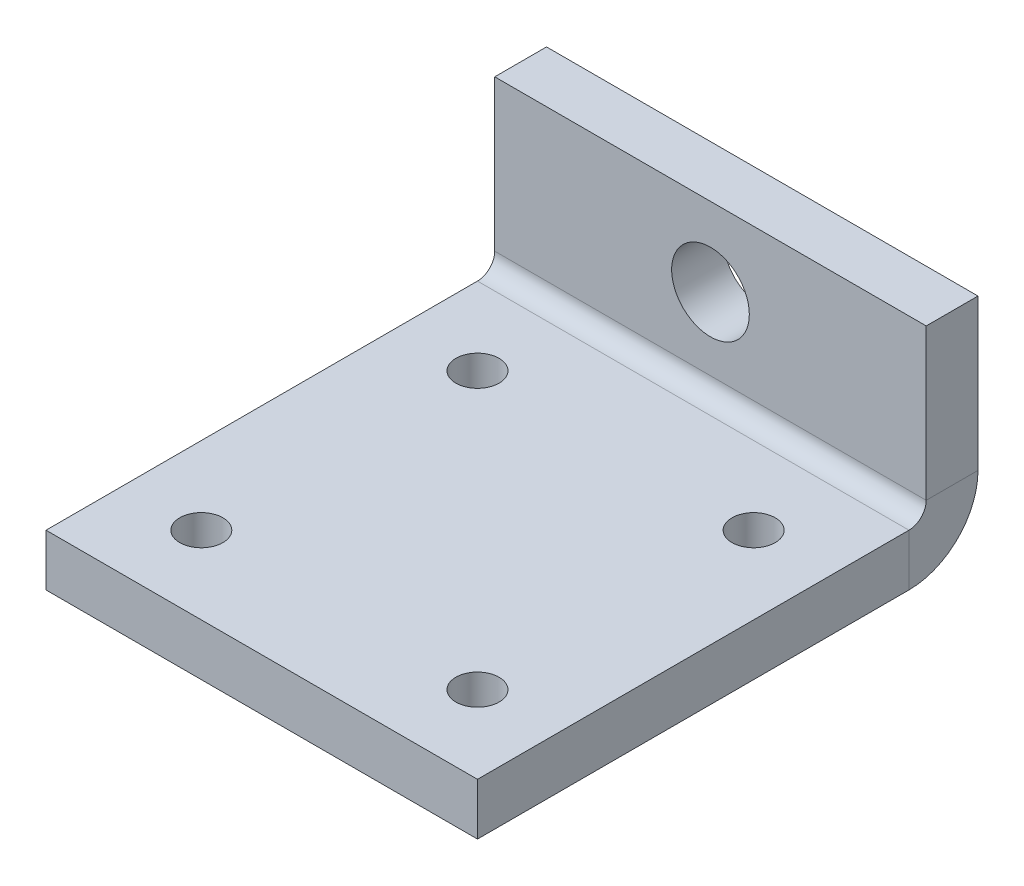
ISO-10303-21;
HEADER;
FILE_DESCRIPTION(('STEP AP214'),'2;1');
FILE_NAME('part.step','',(''),(''),'','','');
FILE_SCHEMA(('AUTOMOTIVE_DESIGN { 1 0 10303 214 1 1 1 1 }'));
ENDSEC;
DATA;
#1=APPLICATION_CONTEXT('core data for automotive mechanical design processes');
#2=APPLICATION_PROTOCOL_DEFINITION('international standard','automotive_design',2000,#1);
#3=PRODUCT_CONTEXT('',#1,'mechanical');
#4=PRODUCT('Part','Part','',(#3));
#5=PRODUCT_RELATED_PRODUCT_CATEGORY('part','',(#4));
#6=PRODUCT_DEFINITION_FORMATION('','',#4);
#7=PRODUCT_DEFINITION_CONTEXT('part definition',#1,'design');
#8=PRODUCT_DEFINITION('design','',#6,#7);
#9=PRODUCT_DEFINITION_SHAPE('','',#8);
#10=(LENGTH_UNIT() NAMED_UNIT(*) SI_UNIT(.MILLI.,.METRE.));
#11=(NAMED_UNIT(*) PLANE_ANGLE_UNIT() SI_UNIT($,.RADIAN.));
#12=(NAMED_UNIT(*) SI_UNIT($,.STERADIAN.) SOLID_ANGLE_UNIT());
#13=UNCERTAINTY_MEASURE_WITH_UNIT(LENGTH_MEASURE(1.E-05),#10,'distance_accuracy_value','');
#14=(GEOMETRIC_REPRESENTATION_CONTEXT(3) GLOBAL_UNCERTAINTY_ASSIGNED_CONTEXT((#13)) GLOBAL_UNIT_ASSIGNED_CONTEXT((#10,
#11,#12)) REPRESENTATION_CONTEXT('',''));
#15=CARTESIAN_POINT('',(0.,0.,0.));
#16=DIRECTION('',(0.,0.,1.));
#17=DIRECTION('',(1.,0.,0.));
#18=AXIS2_PLACEMENT_3D('',#15,#16,#17);
#19=CARTESIAN_POINT('',(25.,0.,3.99999999999999));
#20=DIRECTION('',(1.,0.,0.));
#21=DIRECTION('',(0.,0.,-1.));
#22=AXIS2_PLACEMENT_3D('',#19,#20,#21);
#23=PLANE('',#22);
#24=DIRECTION('',(0.,1.,0.));
#25=VECTOR('',#24,1.);
#26=CARTESIAN_POINT('',(25.,0.,3.99999999999999));
#27=LINE('',#26,#25);
#28=CARTESIAN_POINT('',(25.,0.,3.99999999999999));
#29=VERTEX_POINT('',#28);
#30=CARTESIAN_POINT('',(25.,3.,4.));
#31=VERTEX_POINT('',#30);
#32=EDGE_CURVE('E11',#29,#31,#27,.T.);
#33=ORIENTED_EDGE('',*,*,#32,.F.);
#34=CARTESIAN_POINT('',(25.,4.,4.));
#35=DIRECTION('',(-1.,0.,0.));
#36=DIRECTION('',(0.,0.,1.));
#37=AXIS2_PLACEMENT_3D('',#34,#35,#36);
#38=CIRCLE('',#37,4.);
#39=CARTESIAN_POINT('',(25.,4.,0.));
#40=VERTEX_POINT('',#39);
#41=EDGE_CURVE('E128',#29,#40,#38,.F.);
#42=ORIENTED_EDGE('',*,*,#41,.T.);
#43=DIRECTION('',(0.,0.,-1.));
#44=VECTOR('',#43,1.);
#45=CARTESIAN_POINT('',(25.,4.,3.));
#46=LINE('',#45,#44);
#47=CARTESIAN_POINT('',(25.,4.,3.));
#48=VERTEX_POINT('',#47);
#49=EDGE_CURVE('E46',#48,#40,#46,.T.);
#50=ORIENTED_EDGE('',*,*,#49,.F.);
#51=CARTESIAN_POINT('',(25.,4.,4.));
#52=DIRECTION('',(1.,0.,0.));
#53=DIRECTION('',(0.,0.,-1.));
#54=AXIS2_PLACEMENT_3D('',#51,#52,#53);
#55=CIRCLE('',#54,1.);
#56=EDGE_CURVE('E135',#31,#48,#55,.T.);
#57=ORIENTED_EDGE('',*,*,#56,.F.);
#58=EDGE_LOOP('',(#33,#42,#50,#57));
#59=FACE_BOUND('',#58,.T.);
#60=ADVANCED_FACE('F38',(#59),#23,.T.);
#61=CARTESIAN_POINT('',(25.,4.,3.));
#62=DIRECTION('',(1.,0.,0.));
#63=DIRECTION('',(0.,0.,-1.));
#64=AXIS2_PLACEMENT_3D('',#61,#62,#63);
#65=PLANE('',#64);
#66=DIRECTION('',(0.,0.,-1.));
#67=VECTOR('',#66,1.);
#68=CARTESIAN_POINT('',(25.,0.,0.));
#69=LINE('',#68,#67);
#70=CARTESIAN_POINT('',(25.,0.,29.));
#71=VERTEX_POINT('',#70);
#72=EDGE_CURVE('E123',#71,#29,#69,.T.);
#73=ORIENTED_EDGE('',*,*,#72,.T.);
#74=ORIENTED_EDGE('',*,*,#32,.T.);
#75=DIRECTION('',(0.,0.,-1.));
#76=VECTOR('',#75,1.);
#77=CARTESIAN_POINT('',(25.,3.,0.));
#78=LINE('',#77,#76);
#79=CARTESIAN_POINT('',(25.,3.,29.));
#80=VERTEX_POINT('',#79);
#81=EDGE_CURVE('E133',#80,#31,#78,.T.);
#82=ORIENTED_EDGE('',*,*,#81,.F.);
#83=DIRECTION('',(0.,1.,0.));
#84=VECTOR('',#83,1.);
#85=CARTESIAN_POINT('',(25.,0.,29.));
#86=LINE('',#85,#84);
#87=EDGE_CURVE('E114',#71,#80,#86,.T.);
#88=ORIENTED_EDGE('',*,*,#87,.F.);
#89=EDGE_LOOP('',(#73,#74,#82,#88));
#90=FACE_BOUND('',#89,.T.);
#91=ADVANCED_FACE('F131',(#90),#65,.T.);
#92=CARTESIAN_POINT('',(0.,4.,0.));
#93=DIRECTION('',(-1.,0.,0.));
#94=DIRECTION('',(0.,0.,1.));
#95=AXIS2_PLACEMENT_3D('',#92,#93,#94);
#96=PLANE('',#95);
#97=DIRECTION('',(0.,0.,1.));
#98=VECTOR('',#97,1.);
#99=CARTESIAN_POINT('',(0.,4.,0.));
#100=LINE('',#99,#98);
#101=CARTESIAN_POINT('',(0.,4.,0.));
#102=VERTEX_POINT('',#101);
#103=CARTESIAN_POINT('',(0.,4.,3.));
#104=VERTEX_POINT('',#103);
#105=EDGE_CURVE('E89',#102,#104,#100,.T.);
#106=ORIENTED_EDGE('',*,*,#105,.F.);
#107=CARTESIAN_POINT('',(0.,4.,4.));
#108=DIRECTION('',(-1.,0.,0.));
#109=DIRECTION('',(0.,0.,1.));
#110=AXIS2_PLACEMENT_3D('',#107,#108,#109);
#111=CIRCLE('',#110,4.);
#112=CARTESIAN_POINT('',(0.,0.,3.99999999999999));
#113=VERTEX_POINT('',#112);
#114=EDGE_CURVE('E158',#113,#102,#111,.F.);
#115=ORIENTED_EDGE('',*,*,#114,.F.);
#116=DIRECTION('',(0.,-1.,0.));
#117=VECTOR('',#116,1.);
#118=CARTESIAN_POINT('',(0.,3.,4.));
#119=LINE('',#118,#117);
#120=CARTESIAN_POINT('',(0.,3.,4.));
#121=VERTEX_POINT('',#120);
#122=EDGE_CURVE('E82',#121,#113,#119,.T.);
#123=ORIENTED_EDGE('',*,*,#122,.F.);
#124=CARTESIAN_POINT('',(0.,4.,4.));
#125=DIRECTION('',(1.,0.,0.));
#126=DIRECTION('',(0.,0.,-1.));
#127=AXIS2_PLACEMENT_3D('',#124,#125,#126);
#128=CIRCLE('',#127,1.);
#129=EDGE_CURVE('E151',#121,#104,#128,.T.);
#130=ORIENTED_EDGE('',*,*,#129,.T.);
#131=EDGE_LOOP('',(#106,#115,#123,#130));
#132=FACE_BOUND('',#131,.T.);
#133=ADVANCED_FACE('F190',(#132),#96,.T.);
#134=CARTESIAN_POINT('',(0.,3.,4.));
#135=DIRECTION('',(-1.,0.,0.));
#136=DIRECTION('',(0.,0.,1.));
#137=AXIS2_PLACEMENT_3D('',#134,#135,#136);
#138=PLANE('',#137);
#139=DIRECTION('',(0.,1.,0.));
#140=VECTOR('',#139,1.);
#141=CARTESIAN_POINT('',(0.,0.,0.));
#142=LINE('',#141,#140);
#143=CARTESIAN_POINT('',(0.,12.75,0.));
#144=VERTEX_POINT('',#143);
#145=EDGE_CURVE('E141',#102,#144,#142,.T.);
#146=ORIENTED_EDGE('',*,*,#145,.F.);
#147=ORIENTED_EDGE('',*,*,#105,.T.);
#148=DIRECTION('',(0.,1.,0.));
#149=VECTOR('',#148,1.);
#150=CARTESIAN_POINT('',(0.,0.,3.));
#151=LINE('',#150,#149);
#152=CARTESIAN_POINT('',(0.,12.75,3.));
#153=VERTEX_POINT('',#152);
#154=EDGE_CURVE('E148',#104,#153,#151,.T.);
#155=ORIENTED_EDGE('',*,*,#154,.T.);
#156=DIRECTION('',(0.,0.,-1.));
#157=VECTOR('',#156,1.);
#158=CARTESIAN_POINT('',(0.,12.75,3.));
#159=LINE('',#158,#157);
#160=EDGE_CURVE('E144',#153,#144,#159,.T.);
#161=ORIENTED_EDGE('',*,*,#160,.T.);
#162=EDGE_LOOP('',(#146,#147,#155,#161));
#163=FACE_BOUND('',#162,.T.);
#164=ADVANCED_FACE('F177',(#163),#138,.T.);
#165=CARTESIAN_POINT('',(25.,0.,0.));
#166=DIRECTION('',(0.,0.,1.));
#167=DIRECTION('',(1.,0.,0.));
#168=AXIS2_PLACEMENT_3D('',#165,#166,#167);
#169=PLANE('',#168);
#170=CARTESIAN_POINT('',(12.5,8.2,0.));
#171=DIRECTION('',(0.,0.,1.));
#172=DIRECTION('',(1.,0.,0.));
#173=AXIS2_PLACEMENT_3D('',#170,#171,#172);
#174=CIRCLE('',#173,2.25);
#175=CARTESIAN_POINT('',(14.75,8.2,0.));
#176=VERTEX_POINT('',#175);
#177=EDGE_CURVE('E225',#176,#176,#174,.T.);
#178=ORIENTED_EDGE('',*,*,#177,.T.);
#179=EDGE_LOOP('',(#178));
#180=FACE_BOUND('',#179,.T.);
#181=ORIENTED_EDGE('',*,*,#145,.T.);
#182=DIRECTION('',(-1.,0.,0.));
#183=VECTOR('',#182,1.);
#184=CARTESIAN_POINT('',(25.,12.75,0.));
#185=LINE('',#184,#183);
#186=CARTESIAN_POINT('',(25.,12.75,0.));
#187=VERTEX_POINT('',#186);
#188=EDGE_CURVE('E172',#187,#144,#185,.T.);
#189=ORIENTED_EDGE('',*,*,#188,.F.);
#190=DIRECTION('',(0.,1.,0.));
#191=VECTOR('',#190,1.);
#192=CARTESIAN_POINT('',(25.,0.,0.));
#193=LINE('',#192,#191);
#194=EDGE_CURVE('E95',#40,#187,#193,.T.);
#195=ORIENTED_EDGE('',*,*,#194,.F.);
#196=DIRECTION('',(-1.,0.,0.));
#197=VECTOR('',#196,1.);
#198=CARTESIAN_POINT('',(25.,4.,0.));
#199=LINE('',#198,#197);
#200=EDGE_CURVE('E140',#40,#102,#199,.T.);
#201=ORIENTED_EDGE('',*,*,#200,.T.);
#202=EDGE_LOOP('',(#181,#189,#195,#201));
#203=FACE_BOUND('',#202,.T.);
#204=ADVANCED_FACE('F242',(#180,#203),#169,.F.);
#205=CARTESIAN_POINT('',(25.,12.75,3.));
#206=DIRECTION('',(0.,1.,0.));
#207=DIRECTION('',(0.,0.,1.));
#208=AXIS2_PLACEMENT_3D('',#205,#206,#207);
#209=PLANE('',#208);
#210=ORIENTED_EDGE('',*,*,#160,.F.);
#211=DIRECTION('',(-1.,0.,0.));
#212=VECTOR('',#211,1.);
#213=CARTESIAN_POINT('',(25.,12.75,3.));
#214=LINE('',#213,#212);
#215=CARTESIAN_POINT('',(25.,12.75,3.));
#216=VERTEX_POINT('',#215);
#217=EDGE_CURVE('E170',#216,#153,#214,.T.);
#218=ORIENTED_EDGE('',*,*,#217,.F.);
#219=DIRECTION('',(0.,0.,-1.));
#220=VECTOR('',#219,1.);
#221=CARTESIAN_POINT('',(25.,12.75,3.));
#222=LINE('',#221,#220);
#223=EDGE_CURVE('E196',#216,#187,#222,.T.);
#224=ORIENTED_EDGE('',*,*,#223,.T.);
#225=ORIENTED_EDGE('',*,*,#188,.T.);
#226=EDGE_LOOP('',(#210,#218,#224,#225));
#227=FACE_BOUND('',#226,.T.);
#228=ADVANCED_FACE('F235',(#227),#209,.T.);
#229=CARTESIAN_POINT('',(25.,0.,3.));
#230=DIRECTION('',(0.,0.,1.));
#231=DIRECTION('',(1.,0.,0.));
#232=AXIS2_PLACEMENT_3D('',#229,#230,#231);
#233=PLANE('',#232);
#234=CARTESIAN_POINT('',(12.5,8.2,3.));
#235=DIRECTION('',(0.,0.,1.));
#236=DIRECTION('',(1.,0.,0.));
#237=AXIS2_PLACEMENT_3D('',#234,#235,#236);
#238=CIRCLE('',#237,2.25);
#239=CARTESIAN_POINT('',(14.75,8.2,3.));
#240=VERTEX_POINT('',#239);
#241=EDGE_CURVE('E228',#240,#240,#238,.T.);
#242=ORIENTED_EDGE('',*,*,#241,.F.);
#243=EDGE_LOOP('',(#242));
#244=FACE_BOUND('',#243,.T.);
#245=ORIENTED_EDGE('',*,*,#154,.F.);
#246=DIRECTION('',(-1.,0.,0.));
#247=VECTOR('',#246,1.);
#248=CARTESIAN_POINT('',(25.,4.,3.));
#249=LINE('',#248,#247);
#250=EDGE_CURVE('E167',#48,#104,#249,.T.);
#251=ORIENTED_EDGE('',*,*,#250,.F.);
#252=DIRECTION('',(0.,1.,0.));
#253=VECTOR('',#252,1.);
#254=CARTESIAN_POINT('',(25.,0.,3.));
#255=LINE('',#254,#253);
#256=EDGE_CURVE('E195',#48,#216,#255,.T.);
#257=ORIENTED_EDGE('',*,*,#256,.T.);
#258=ORIENTED_EDGE('',*,*,#217,.T.);
#259=EDGE_LOOP('',(#245,#251,#257,#258));
#260=FACE_BOUND('',#259,.T.);
#261=ADVANCED_FACE('F188',(#244,#260),#233,.T.);
#262=CARTESIAN_POINT('',(25.,4.,4.));
#263=DIRECTION('',(-1.,0.,0.));
#264=DIRECTION('',(0.,0.,1.));
#265=AXIS2_PLACEMENT_3D('',#262,#263,#264);
#266=CYLINDRICAL_SURFACE('',#265,1.);
#267=ORIENTED_EDGE('',*,*,#129,.F.);
#268=DIRECTION('',(-1.,0.,0.));
#269=VECTOR('',#268,1.);
#270=CARTESIAN_POINT('',(25.,3.,4.));
#271=LINE('',#270,#269);
#272=EDGE_CURVE('E164',#31,#121,#271,.T.);
#273=ORIENTED_EDGE('',*,*,#272,.F.);
#274=ORIENTED_EDGE('',*,*,#56,.T.);
#275=ORIENTED_EDGE('',*,*,#250,.T.);
#276=EDGE_LOOP('',(#267,#273,#274,#275));
#277=FACE_BOUND('',#276,.T.);
#278=ADVANCED_FACE('F183',(#277),#266,.F.);
#279=CARTESIAN_POINT('',(25.,3.,0.));
#280=DIRECTION('',(0.,1.,0.));
#281=DIRECTION('',(0.,0.,1.));
#282=AXIS2_PLACEMENT_3D('',#279,#280,#281);
#283=PLANE('',#282);
#284=CARTESIAN_POINT('',(4.5,3.,24.5));
#285=DIRECTION('',(0.,1.,0.));
#286=DIRECTION('',(0.,0.,1.));
#287=AXIS2_PLACEMENT_3D('',#284,#285,#286);
#288=CIRCLE('',#287,1.24999999999999);
#289=CARTESIAN_POINT('',(4.5,3.,25.75));
#290=VERTEX_POINT('',#289);
#291=EDGE_CURVE('E222',#290,#290,#288,.T.);
#292=ORIENTED_EDGE('',*,*,#291,.F.);
#293=EDGE_LOOP('',(#292));
#294=FACE_BOUND('',#293,.T.);
#295=CARTESIAN_POINT('',(4.5,3.,8.5));
#296=DIRECTION('',(0.,1.,0.));
#297=DIRECTION('',(0.,0.,1.));
#298=AXIS2_PLACEMENT_3D('',#295,#296,#297);
#299=CIRCLE('',#298,1.24999999999999);
#300=CARTESIAN_POINT('',(4.5,3.,9.74999999999999));
#301=VERTEX_POINT('',#300);
#302=EDGE_CURVE('E216',#301,#301,#299,.T.);
#303=ORIENTED_EDGE('',*,*,#302,.F.);
#304=EDGE_LOOP('',(#303));
#305=FACE_BOUND('',#304,.T.);
#306=CARTESIAN_POINT('',(20.5,3.,8.5));
#307=DIRECTION('',(0.,1.,0.));
#308=DIRECTION('',(0.,0.,1.));
#309=AXIS2_PLACEMENT_3D('',#306,#307,#308);
#310=CIRCLE('',#309,1.24999999999999);
#311=CARTESIAN_POINT('',(20.5,3.,9.74999999999999));
#312=VERTEX_POINT('',#311);
#313=EDGE_CURVE('E210',#312,#312,#310,.T.);
#314=ORIENTED_EDGE('',*,*,#313,.F.);
#315=EDGE_LOOP('',(#314));
#316=FACE_BOUND('',#315,.T.);
#317=CARTESIAN_POINT('',(20.5,3.,24.5));
#318=DIRECTION('',(0.,1.,0.));
#319=DIRECTION('',(0.,0.,1.));
#320=AXIS2_PLACEMENT_3D('',#317,#318,#319);
#321=CIRCLE('',#320,1.24999999999999);
#322=CARTESIAN_POINT('',(20.5,3.,25.75));
#323=VERTEX_POINT('',#322);
#324=EDGE_CURVE('E204',#323,#323,#321,.T.);
#325=ORIENTED_EDGE('',*,*,#324,.F.);
#326=EDGE_LOOP('',(#325));
#327=FACE_BOUND('',#326,.T.);
#328=DIRECTION('',(0.,0.,-1.));
#329=VECTOR('',#328,1.);
#330=CARTESIAN_POINT('',(0.,3.,0.));
#331=LINE('',#330,#329);
#332=CARTESIAN_POINT('',(0.,3.,29.));
#333=VERTEX_POINT('',#332);
#334=EDGE_CURVE('E153',#333,#121,#331,.T.);
#335=ORIENTED_EDGE('',*,*,#334,.F.);
#336=DIRECTION('',(-1.,0.,0.));
#337=VECTOR('',#336,1.);
#338=CARTESIAN_POINT('',(25.,3.,29.));
#339=LINE('',#338,#337);
#340=EDGE_CURVE('E118',#80,#333,#339,.T.);
#341=ORIENTED_EDGE('',*,*,#340,.F.);
#342=ORIENTED_EDGE('',*,*,#81,.T.);
#343=ORIENTED_EDGE('',*,*,#272,.T.);
#344=EDGE_LOOP('',(#335,#341,#342,#343));
#345=FACE_BOUND('',#344,.T.);
#346=ADVANCED_FACE('F193',(#294,#305,#316,#327,#345),#283,.T.);
#347=CARTESIAN_POINT('',(25.,0.,29.));
#348=DIRECTION('',(0.,0.,1.));
#349=DIRECTION('',(1.,0.,0.));
#350=AXIS2_PLACEMENT_3D('',#347,#348,#349);
#351=PLANE('',#350);
#352=DIRECTION('',(0.,1.,0.));
#353=VECTOR('',#352,1.);
#354=CARTESIAN_POINT('',(0.,0.,29.));
#355=LINE('',#354,#353);
#356=CARTESIAN_POINT('',(0.,0.,29.));
#357=VERTEX_POINT('',#356);
#358=EDGE_CURVE('E116',#357,#333,#355,.T.);
#359=ORIENTED_EDGE('',*,*,#358,.F.);
#360=DIRECTION('',(-1.,0.,0.));
#361=VECTOR('',#360,1.);
#362=CARTESIAN_POINT('',(25.,0.,29.));
#363=LINE('',#362,#361);
#364=EDGE_CURVE('E110',#71,#357,#363,.T.);
#365=ORIENTED_EDGE('',*,*,#364,.F.);
#366=ORIENTED_EDGE('',*,*,#87,.T.);
#367=ORIENTED_EDGE('',*,*,#340,.T.);
#368=EDGE_LOOP('',(#359,#365,#366,#367));
#369=FACE_BOUND('',#368,.T.);
#370=ADVANCED_FACE('F112',(#369),#351,.T.);
#371=CARTESIAN_POINT('',(25.,0.,0.));
#372=DIRECTION('',(0.,1.,0.));
#373=DIRECTION('',(0.,0.,1.));
#374=AXIS2_PLACEMENT_3D('',#371,#372,#373);
#375=PLANE('',#374);
#376=CARTESIAN_POINT('',(4.5,0.,24.5));
#377=DIRECTION('',(0.,1.,0.));
#378=DIRECTION('',(0.,0.,1.));
#379=AXIS2_PLACEMENT_3D('',#376,#377,#378);
#380=CIRCLE('',#379,1.24999999999999);
#381=CARTESIAN_POINT('',(4.5,0.,25.75));
#382=VERTEX_POINT('',#381);
#383=EDGE_CURVE('E219',#382,#382,#380,.T.);
#384=ORIENTED_EDGE('',*,*,#383,.T.);
#385=EDGE_LOOP('',(#384));
#386=FACE_BOUND('',#385,.T.);
#387=CARTESIAN_POINT('',(4.5,0.,8.5));
#388=DIRECTION('',(0.,1.,0.));
#389=DIRECTION('',(0.,0.,1.));
#390=AXIS2_PLACEMENT_3D('',#387,#388,#389);
#391=CIRCLE('',#390,1.24999999999999);
#392=CARTESIAN_POINT('',(4.5,0.,9.74999999999999));
#393=VERTEX_POINT('',#392);
#394=EDGE_CURVE('E213',#393,#393,#391,.T.);
#395=ORIENTED_EDGE('',*,*,#394,.T.);
#396=EDGE_LOOP('',(#395));
#397=FACE_BOUND('',#396,.T.);
#398=CARTESIAN_POINT('',(20.5,0.,8.5));
#399=DIRECTION('',(0.,1.,0.));
#400=DIRECTION('',(0.,0.,1.));
#401=AXIS2_PLACEMENT_3D('',#398,#399,#400);
#402=CIRCLE('',#401,1.24999999999999);
#403=CARTESIAN_POINT('',(20.5,0.,9.74999999999999));
#404=VERTEX_POINT('',#403);
#405=EDGE_CURVE('E207',#404,#404,#402,.T.);
#406=ORIENTED_EDGE('',*,*,#405,.T.);
#407=EDGE_LOOP('',(#406));
#408=FACE_BOUND('',#407,.T.);
#409=CARTESIAN_POINT('',(20.5,0.,24.5));
#410=DIRECTION('',(0.,1.,0.));
#411=DIRECTION('',(0.,0.,1.));
#412=AXIS2_PLACEMENT_3D('',#409,#410,#411);
#413=CIRCLE('',#412,1.24999999999999);
#414=CARTESIAN_POINT('',(20.5,0.,25.75));
#415=VERTEX_POINT('',#414);
#416=EDGE_CURVE('E145',#415,#415,#413,.T.);
#417=ORIENTED_EDGE('',*,*,#416,.T.);
#418=EDGE_LOOP('',(#417));
#419=FACE_BOUND('',#418,.T.);
#420=DIRECTION('',(0.,0.,-1.));
#421=VECTOR('',#420,1.);
#422=CARTESIAN_POINT('',(0.,0.,0.));
#423=LINE('',#422,#421);
#424=EDGE_CURVE('E156',#357,#113,#423,.T.);
#425=ORIENTED_EDGE('',*,*,#424,.T.);
#426=DIRECTION('',(-1.,0.,0.));
#427=VECTOR('',#426,1.);
#428=CARTESIAN_POINT('',(25.,0.,3.99999999999999));
#429=LINE('',#428,#427);
#430=EDGE_CURVE('E119',#29,#113,#429,.T.);
#431=ORIENTED_EDGE('',*,*,#430,.F.);
#432=ORIENTED_EDGE('',*,*,#72,.F.);
#433=ORIENTED_EDGE('',*,*,#364,.T.);
#434=EDGE_LOOP('',(#425,#431,#432,#433));
#435=FACE_BOUND('',#434,.T.);
#436=ADVANCED_FACE('F124',(#386,#397,#408,#419,#435),#375,.F.);
#437=CARTESIAN_POINT('',(25.,4.,4.));
#438=DIRECTION('',(-1.,0.,0.));
#439=DIRECTION('',(0.,0.,1.));
#440=AXIS2_PLACEMENT_3D('',#437,#438,#439);
#441=CYLINDRICAL_SURFACE('',#440,4.);
#442=ORIENTED_EDGE('',*,*,#114,.T.);
#443=ORIENTED_EDGE('',*,*,#200,.F.);
#444=ORIENTED_EDGE('',*,*,#41,.F.);
#445=ORIENTED_EDGE('',*,*,#430,.T.);
#446=EDGE_LOOP('',(#442,#443,#444,#445));
#447=FACE_BOUND('',#446,.T.);
#448=ADVANCED_FACE('F266',(#447),#441,.T.);
#449=CARTESIAN_POINT('',(25.,4.,4.));
#450=DIRECTION('',(1.,0.,0.));
#451=DIRECTION('',(0.,0.,-1.));
#452=AXIS2_PLACEMENT_3D('',#449,#450,#451);
#453=PLANE('',#452);
#454=ORIENTED_EDGE('',*,*,#194,.T.);
#455=ORIENTED_EDGE('',*,*,#223,.F.);
#456=ORIENTED_EDGE('',*,*,#256,.F.);
#457=ORIENTED_EDGE('',*,*,#49,.T.);
#458=EDGE_LOOP('',(#454,#455,#456,#457));
#459=FACE_BOUND('',#458,.T.);
#460=ADVANCED_FACE('F263',(#459),#453,.T.);
#461=CARTESIAN_POINT('',(0.,4.,4.));
#462=DIRECTION('',(1.,0.,0.));
#463=DIRECTION('',(0.,0.,-1.));
#464=AXIS2_PLACEMENT_3D('',#461,#462,#463);
#465=PLANE('',#464);
#466=ORIENTED_EDGE('',*,*,#334,.T.);
#467=ORIENTED_EDGE('',*,*,#122,.T.);
#468=ORIENTED_EDGE('',*,*,#424,.F.);
#469=ORIENTED_EDGE('',*,*,#358,.T.);
#470=EDGE_LOOP('',(#466,#467,#468,#469));
#471=FACE_BOUND('',#470,.T.);
#472=ADVANCED_FACE('F265',(#471),#465,.F.);
#473=CARTESIAN_POINT('',(20.5,3.,24.5));
#474=DIRECTION('',(0.,1.,0.));
#475=DIRECTION('',(0.,0.,1.));
#476=AXIS2_PLACEMENT_3D('',#473,#474,#475);
#477=CYLINDRICAL_SURFACE('',#476,1.24999999999999);
#478=ORIENTED_EDGE('',*,*,#416,.F.);
#479=EDGE_LOOP('',(#478));
#480=FACE_BOUND('',#479,.T.);
#481=ORIENTED_EDGE('',*,*,#324,.T.);
#482=EDGE_LOOP('',(#481));
#483=FACE_BOUND('',#482,.T.);
#484=ADVANCED_FACE('F272',(#480,#483),#477,.F.);
#485=CARTESIAN_POINT('',(20.5,3.,8.5));
#486=DIRECTION('',(0.,1.,0.));
#487=DIRECTION('',(0.,0.,1.));
#488=AXIS2_PLACEMENT_3D('',#485,#486,#487);
#489=CYLINDRICAL_SURFACE('',#488,1.24999999999999);
#490=ORIENTED_EDGE('',*,*,#405,.F.);
#491=EDGE_LOOP('',(#490));
#492=FACE_BOUND('',#491,.T.);
#493=ORIENTED_EDGE('',*,*,#313,.T.);
#494=EDGE_LOOP('',(#493));
#495=FACE_BOUND('',#494,.T.);
#496=ADVANCED_FACE('F297',(#492,#495),#489,.F.);
#497=CARTESIAN_POINT('',(4.5,3.,8.5));
#498=DIRECTION('',(0.,1.,0.));
#499=DIRECTION('',(0.,0.,1.));
#500=AXIS2_PLACEMENT_3D('',#497,#498,#499);
#501=CYLINDRICAL_SURFACE('',#500,1.24999999999999);
#502=ORIENTED_EDGE('',*,*,#394,.F.);
#503=EDGE_LOOP('',(#502));
#504=FACE_BOUND('',#503,.T.);
#505=ORIENTED_EDGE('',*,*,#302,.T.);
#506=EDGE_LOOP('',(#505));
#507=FACE_BOUND('',#506,.T.);
#508=ADVANCED_FACE('F302',(#504,#507),#501,.F.);
#509=CARTESIAN_POINT('',(4.5,3.,24.5));
#510=DIRECTION('',(0.,1.,0.));
#511=DIRECTION('',(0.,0.,1.));
#512=AXIS2_PLACEMENT_3D('',#509,#510,#511);
#513=CYLINDRICAL_SURFACE('',#512,1.24999999999999);
#514=ORIENTED_EDGE('',*,*,#383,.F.);
#515=EDGE_LOOP('',(#514));
#516=FACE_BOUND('',#515,.T.);
#517=ORIENTED_EDGE('',*,*,#291,.T.);
#518=EDGE_LOOP('',(#517));
#519=FACE_BOUND('',#518,.T.);
#520=ADVANCED_FACE('F309',(#516,#519),#513,.F.);
#521=CARTESIAN_POINT('',(12.5,8.2,3.));
#522=DIRECTION('',(0.,0.,1.));
#523=DIRECTION('',(1.,0.,0.));
#524=AXIS2_PLACEMENT_3D('',#521,#522,#523);
#525=CYLINDRICAL_SURFACE('',#524,2.25);
#526=ORIENTED_EDGE('',*,*,#177,.F.);
#527=EDGE_LOOP('',(#526));
#528=FACE_BOUND('',#527,.T.);
#529=ORIENTED_EDGE('',*,*,#241,.T.);
#530=EDGE_LOOP('',(#529));
#531=FACE_BOUND('',#530,.T.);
#532=ADVANCED_FACE('F232',(#528,#531),#525,.F.);
#533=CLOSED_SHELL('',(#60,#91,#133,#164,#204,#228,#261,#278,#346,#370,#436,#448,#460,#472,#484,
#496,#508,#520,#532));
#534=MANIFOLD_SOLID_BREP('B2',#533);
#535=ADVANCED_BREP_SHAPE_REPRESENTATION('',(#18,#534),#14);
#536=SHAPE_DEFINITION_REPRESENTATION(#9,#535);
ENDSEC;
END-ISO-10303-21;
